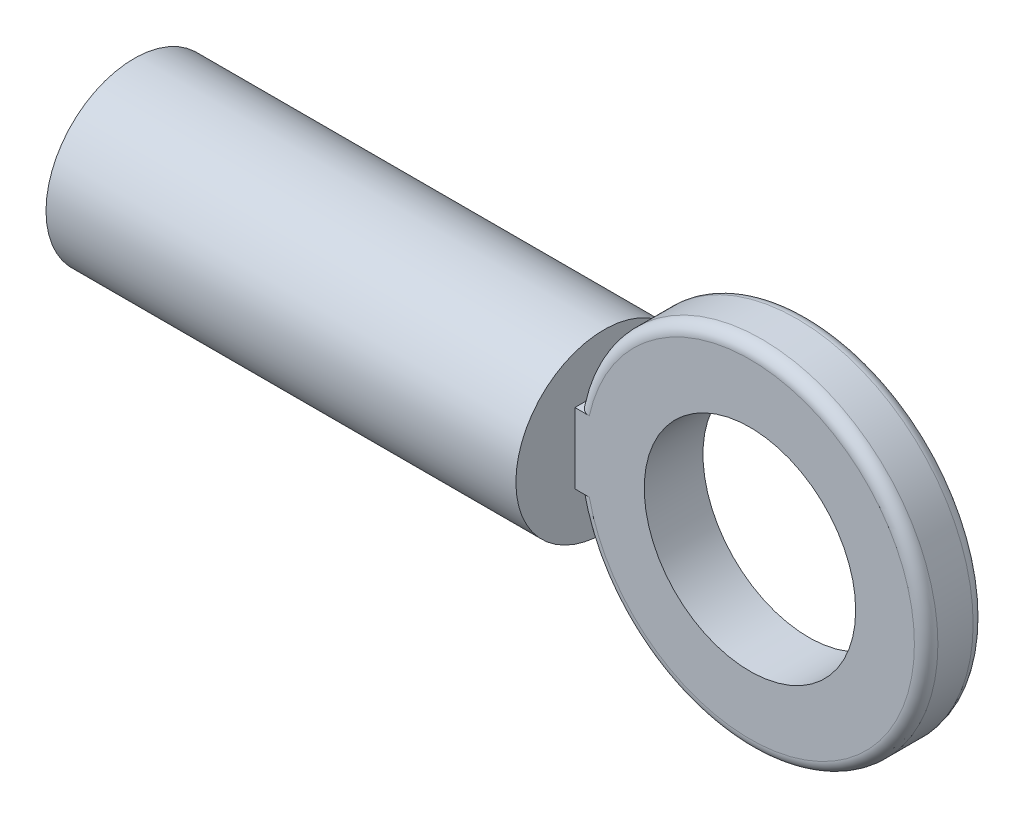
ISO-10303-21;
HEADER;
FILE_DESCRIPTION(('STEP AP214'),'2;1');
FILE_NAME('part.step','',(''),(''),'','','');
FILE_SCHEMA(('AUTOMOTIVE_DESIGN { 1 0 10303 214 1 1 1 1 }'));
ENDSEC;
DATA;
#1=APPLICATION_CONTEXT('core data for automotive mechanical design processes');
#2=APPLICATION_PROTOCOL_DEFINITION('international standard','automotive_design',2000,#1);
#3=PRODUCT_CONTEXT('',#1,'mechanical');
#4=PRODUCT('Part','Part','',(#3));
#5=PRODUCT_RELATED_PRODUCT_CATEGORY('part','',(#4));
#6=PRODUCT_DEFINITION_FORMATION('','',#4);
#7=PRODUCT_DEFINITION_CONTEXT('part definition',#1,'design');
#8=PRODUCT_DEFINITION('design','',#6,#7);
#9=PRODUCT_DEFINITION_SHAPE('','',#8);
#10=(LENGTH_UNIT() NAMED_UNIT(*) SI_UNIT(.MILLI.,.METRE.));
#11=(NAMED_UNIT(*) PLANE_ANGLE_UNIT() SI_UNIT($,.RADIAN.));
#12=(NAMED_UNIT(*) SI_UNIT($,.STERADIAN.) SOLID_ANGLE_UNIT());
#13=UNCERTAINTY_MEASURE_WITH_UNIT(LENGTH_MEASURE(1.E-05),#10,'distance_accuracy_value','');
#14=(GEOMETRIC_REPRESENTATION_CONTEXT(3) GLOBAL_UNCERTAINTY_ASSIGNED_CONTEXT((#13)) GLOBAL_UNIT_ASSIGNED_CONTEXT((#10,
#11,#12)) REPRESENTATION_CONTEXT('',''));
#15=CARTESIAN_POINT('',(0.,0.,0.));
#16=DIRECTION('',(0.,0.,1.));
#17=DIRECTION('',(1.,0.,0.));
#18=AXIS2_PLACEMENT_3D('',#15,#16,#17);
#19=CARTESIAN_POINT('',(-14.6969384566991,3.,5.));
#20=DIRECTION('',(0.,-1.,0.));
#21=DIRECTION('',(0.,0.,-1.));
#22=AXIS2_PLACEMENT_3D('',#19,#20,#21);
#23=PLANE('',#22);
#24=DIRECTION('',(0.,0.,-1.));
#25=VECTOR('',#24,1.);
#26=CARTESIAN_POINT('',(-14.8989794855664,3.,5.));
#27=LINE('',#26,#25);
#28=CARTESIAN_POINT('',(-14.8989794855664,3.,5.));
#29=VERTEX_POINT('',#28);
#30=CARTESIAN_POINT('',(-14.8989794855664,3.,0.));
#31=VERTEX_POINT('',#30);
#32=EDGE_CURVE('E65',#29,#31,#27,.T.);
#33=ORIENTED_EDGE('',*,*,#32,.F.);
#34=DIRECTION('',(-1.,0.,0.));
#35=VECTOR('',#34,1.);
#36=CARTESIAN_POINT('',(-14.6969384566991,3.,5.));
#37=LINE('',#36,#35);
#38=CARTESIAN_POINT('',(-13.6747943311773,3.,5.));
#39=VERTEX_POINT('',#38);
#40=EDGE_CURVE('E102',#39,#29,#37,.T.);
#41=ORIENTED_EDGE('',*,*,#40,.F.);
#42=CARTESIAN_POINT('',(-13.6747943311773,3.,5.));
#43=CARTESIAN_POINT('',(-13.7332773974036,3.,5.00004397370666));
#44=CARTESIAN_POINT('',(-13.7917566209697,3.,4.99510750923122));
#45=CARTESIAN_POINT('',(-13.9070751236367,3.,4.97556814786607));
#46=CARTESIAN_POINT('',(-13.9639144738787,3.,4.960965670968));
#47=CARTESIAN_POINT('',(-14.0743693140329,3.,4.92237366519746));
#48=CARTESIAN_POINT('',(-14.1279822597004,3.,4.89837683729497));
#49=CARTESIAN_POINT('',(-14.2303317389948,3.,4.84162531355459));
#50=CARTESIAN_POINT('',(-14.279070214233,3.,4.80887412402157));
#51=CARTESIAN_POINT('',(-14.3696436149678,3.,4.7359269444308));
#52=CARTESIAN_POINT('',(-14.4115551423863,3.,4.69582612637257));
#53=CARTESIAN_POINT('',(-14.4878842592286,3.,4.60901084651316));
#54=CARTESIAN_POINT('',(-14.5223006974817,3.,4.56229537058255));
#55=CARTESIAN_POINT('',(-14.5818850615291,3.,4.46463995957378));
#56=CARTESIAN_POINT('',(-14.6072307540319,3.,4.41380833124174));
#57=CARTESIAN_POINT('',(-14.6488326492022,3.,4.3085739468775));
#58=CARTESIAN_POINT('',(-14.665096927209,3.,4.25417441174859));
#59=CARTESIAN_POINT('',(-14.6833357439718,3.,4.16611761834799));
#60=CARTESIAN_POINT('',(-14.6884340691561,3.,4.13307648260181));
#61=CARTESIAN_POINT('',(-14.6952343004088,3.,4.06669547756618));
#62=CARTESIAN_POINT('',(-14.6969411623811,3.,4.03335611579334));
#63=CARTESIAN_POINT('',(-14.6969384566991,3.,4.));
#64=B_SPLINE_CURVE_WITH_KNOTS('',3,(#42,#43,#44,#45,#46,#47,#48,#49,#50,#51,#52,#53,#54,#55,#56,
#57,#58,#59,#60,#61,#62,#63),.UNSPECIFIED.,.F.,.F.,(4,2,2,2,2,2,2,2,2,2,4),(0.,
0.175237283661099,0.350466953700384,0.525833041161972,0.701128995810935,0.874297596550424,
1.04749277552178,1.21707912193985,1.38651442832325,1.48665279755499,1.58664472787211),.UNSPECIFIED.);
#65=CARTESIAN_POINT('',(-14.6969384566991,3.,4.));
#66=VERTEX_POINT('',#65);
#67=EDGE_CURVE('E196',#39,#66,#64,.T.);
#68=ORIENTED_EDGE('',*,*,#67,.T.);
#69=DIRECTION('',(0.,0.,-1.));
#70=VECTOR('',#69,1.);
#71=CARTESIAN_POINT('',(-14.6969384566991,3.,5.));
#72=LINE('',#71,#70);
#73=CARTESIAN_POINT('',(-14.6969384566991,3.,1.));
#74=VERTEX_POINT('',#73);
#75=EDGE_CURVE('E131',#66,#74,#72,.T.);
#76=ORIENTED_EDGE('',*,*,#75,.T.);
#77=CARTESIAN_POINT('',(-14.6969384566991,3.,1.));
#78=CARTESIAN_POINT('',(-14.6969385501578,3.,0.972285889496588));
#79=CARTESIAN_POINT('',(-14.695761829512,3.,0.944585193604562));
#80=CARTESIAN_POINT('',(-14.6910693122999,3.,0.889385040622232));
#81=CARTESIAN_POINT('',(-14.6875537169513,3.,0.861885566426197));
#82=CARTESIAN_POINT('',(-14.6735405994503,3.,0.780062849960405));
#83=CARTESIAN_POINT('',(-14.6595765976205,3.,0.726292599048655));
#84=CARTESIAN_POINT('',(-14.6228352807175,3.,0.621869210937748));
#85=CARTESIAN_POINT('',(-14.6000553727367,3.,0.571216995890707));
#86=CARTESIAN_POINT('',(-14.5463843131368,3.,0.474408286993331));
#87=CARTESIAN_POINT('',(-14.5154933563998,3.,0.428251685164557));
#88=CARTESIAN_POINT('',(-14.4462349607081,3.,0.341305552933714));
#89=CARTESIAN_POINT('',(-14.4078068508312,3.,0.300564405243511));
#90=CARTESIAN_POINT('',(-14.3247651340901,3.,0.225957290863242));
#91=CARTESIAN_POINT('',(-14.2801501905498,3.,0.192092813796366));
#92=CARTESIAN_POINT('',(-14.1850908586779,3.,0.13150251246788));
#93=CARTESIAN_POINT('',(-14.1345501252878,3.,0.104928016355623));
#94=CARTESIAN_POINT('',(-14.0297912005071,3.,0.0604556675639553));
#95=CARTESIAN_POINT('',(-13.975573947962,3.,0.042555609197942));
#96=CARTESIAN_POINT('',(-13.8801045624826,3.,0.0194918852721922));
#97=CARTESIAN_POINT('',(-13.8393557008949,3.,0.0121849036763054));
#98=CARTESIAN_POINT('',(-13.7573401994797,3.,0.00243908445292194));
#99=CARTESIAN_POINT('',(-13.7160744025564,3.,-6.84575789281902E-06));
#100=CARTESIAN_POINT('',(-13.6747943311773,3.,0.));
#101=B_SPLINE_CURVE_WITH_KNOTS('',3,(#77,#78,#79,#80,#81,#82,#83,#84,#85,#86,#87,#88,#89,#90,
#91,#92,#93,#94,#95,#96,#97,#98,#99,#100),.UNSPECIFIED.,.F.,.F.,(4,2,2,2,2,2,2,2,2,2,2,4),(0.,
0.0830907896102643,0.166174431691594,0.331978300145524,0.497830971437731,0.663679658194319,
0.830922621423314,0.998201774237879,1.16872798402752,1.33921081060304,1.46313142794583,
1.58687110409068),.UNSPECIFIED.);
#102=CARTESIAN_POINT('',(-13.6747943311773,3.,0.));
#103=VERTEX_POINT('',#102);
#104=EDGE_CURVE('E143',#74,#103,#101,.T.);
#105=ORIENTED_EDGE('',*,*,#104,.T.);
#106=DIRECTION('',(-1.,0.,0.));
#107=VECTOR('',#106,1.);
#108=CARTESIAN_POINT('',(-14.6969384566991,3.,0.));
#109=LINE('',#108,#107);
#110=EDGE_CURVE('E103',#103,#31,#109,.T.);
#111=ORIENTED_EDGE('',*,*,#110,.T.);
#112=EDGE_LOOP('',(#33,#41,#68,#76,#105,#111));
#113=FACE_BOUND('',#112,.T.);
#114=ADVANCED_FACE('F41',(#113),#23,.F.);
#115=CARTESIAN_POINT('',(-14.6969384566991,-3.,5.));
#116=DIRECTION('',(0.,1.,0.));
#117=DIRECTION('',(0.,0.,1.));
#118=AXIS2_PLACEMENT_3D('',#115,#116,#117);
#119=PLANE('',#118);
#120=DIRECTION('',(0.,0.,1.));
#121=VECTOR('',#120,1.);
#122=CARTESIAN_POINT('',(-14.8989794855664,-3.,5.));
#123=LINE('',#122,#121);
#124=CARTESIAN_POINT('',(-14.8989794855664,-3.,0.));
#125=VERTEX_POINT('',#124);
#126=CARTESIAN_POINT('',(-14.8989794855664,-3.,5.));
#127=VERTEX_POINT('',#126);
#128=EDGE_CURVE('E106',#125,#127,#123,.T.);
#129=ORIENTED_EDGE('',*,*,#128,.F.);
#130=DIRECTION('',(1.,0.,0.));
#131=VECTOR('',#130,1.);
#132=CARTESIAN_POINT('',(-14.6969384566991,-3.,0.));
#133=LINE('',#132,#131);
#134=CARTESIAN_POINT('',(-13.6747943311773,-3.,0.));
#135=VERTEX_POINT('',#134);
#136=EDGE_CURVE('E95',#125,#135,#133,.T.);
#137=ORIENTED_EDGE('',*,*,#136,.T.);
#138=CARTESIAN_POINT('',(-13.6747943311773,-3.,0.));
#139=CARTESIAN_POINT('',(-13.7332773974036,-3.,-4.39737066575906E-05));
#140=CARTESIAN_POINT('',(-13.7917566209697,-3.,0.00489249076878266));
#141=CARTESIAN_POINT('',(-13.9070751236367,-3.,0.0244318521339298));
#142=CARTESIAN_POINT('',(-13.9639144738787,-3.,0.0390343290319995));
#143=CARTESIAN_POINT('',(-14.0743693140329,-3.,0.0776263348025358));
#144=CARTESIAN_POINT('',(-14.1279822597004,-3.,0.10162316270503));
#145=CARTESIAN_POINT('',(-14.2303317389948,-3.,0.158374686445411));
#146=CARTESIAN_POINT('',(-14.279070214233,-3.,0.19112587597843));
#147=CARTESIAN_POINT('',(-14.3696436149678,-3.,0.264073055569197));
#148=CARTESIAN_POINT('',(-14.4115551423863,-3.,0.304173873627432));
#149=CARTESIAN_POINT('',(-14.4878842592286,-3.,0.390989153486845));
#150=CARTESIAN_POINT('',(-14.5223006974817,-3.,0.437704629417454));
#151=CARTESIAN_POINT('',(-14.5818850615291,-3.,0.535360040426225));
#152=CARTESIAN_POINT('',(-14.6072307540319,-3.,0.586191668758255));
#153=CARTESIAN_POINT('',(-14.6488326492022,-3.,0.691426053122499));
#154=CARTESIAN_POINT('',(-14.665096927209,-3.,0.745825588251411));
#155=CARTESIAN_POINT('',(-14.6833357439718,-3.,0.833882381652008));
#156=CARTESIAN_POINT('',(-14.6884340691561,-3.,0.866923517398192));
#157=CARTESIAN_POINT('',(-14.6952343004088,-3.,0.933304522433815));
#158=CARTESIAN_POINT('',(-14.6969411623811,-3.,0.96664388420666));
#159=CARTESIAN_POINT('',(-14.6969384566991,-3.,0.999999999999999));
#160=B_SPLINE_CURVE_WITH_KNOTS('',3,(#138,#139,#140,#141,#142,#143,#144,#145,#146,#147,#148,
#149,#150,#151,#152,#153,#154,#155,#156,#157,#158,#159),.UNSPECIFIED.,.F.,.F.,(4,2,2,2,2,2,2,2,
2,2,4),(0.,0.175237283661099,0.350466953700384,0.525833041161968,0.701128995810935,
0.874297596550425,1.04749277552178,1.21707912193985,1.38651442832325,1.48665279755499,
1.58664472787211),.UNSPECIFIED.);
#161=CARTESIAN_POINT('',(-14.6969384566991,-3.,1.));
#162=VERTEX_POINT('',#161);
#163=EDGE_CURVE('E151',#135,#162,#160,.T.);
#164=ORIENTED_EDGE('',*,*,#163,.T.);
#165=DIRECTION('',(0.,0.,-1.));
#166=VECTOR('',#165,1.);
#167=CARTESIAN_POINT('',(-14.6969384566991,-3.,5.));
#168=LINE('',#167,#166);
#169=CARTESIAN_POINT('',(-14.6969384566991,-3.,4.));
#170=VERTEX_POINT('',#169);
#171=EDGE_CURVE('E127',#170,#162,#168,.T.);
#172=ORIENTED_EDGE('',*,*,#171,.F.);
#173=CARTESIAN_POINT('',(-14.6969384566991,-3.,4.));
#174=CARTESIAN_POINT('',(-14.6969385501578,-3.,4.02771411050341));
#175=CARTESIAN_POINT('',(-14.695761829512,-3.,4.05541480639544));
#176=CARTESIAN_POINT('',(-14.6910693122999,-3.,4.11061495937777));
#177=CARTESIAN_POINT('',(-14.6875537169513,-3.,4.1381144335738));
#178=CARTESIAN_POINT('',(-14.6735405994503,-3.,4.21993715003959));
#179=CARTESIAN_POINT('',(-14.6595765976205,-3.,4.27370740095134));
#180=CARTESIAN_POINT('',(-14.6228352807175,-3.,4.37813078906225));
#181=CARTESIAN_POINT('',(-14.6000553727367,-3.,4.42878300410929));
#182=CARTESIAN_POINT('',(-14.5463843131368,-3.,4.52559171300667));
#183=CARTESIAN_POINT('',(-14.5154933563998,-3.,4.57174831483544));
#184=CARTESIAN_POINT('',(-14.4462349607081,-3.,4.65869444706629));
#185=CARTESIAN_POINT('',(-14.4078068508312,-3.,4.69943559475649));
#186=CARTESIAN_POINT('',(-14.3247651340901,-3.,4.77404270913676));
#187=CARTESIAN_POINT('',(-14.2801501905498,-3.,4.80790718620363));
#188=CARTESIAN_POINT('',(-14.1850908586779,-3.,4.86849748753212));
#189=CARTESIAN_POINT('',(-14.1345501252878,-3.,4.89507198364438));
#190=CARTESIAN_POINT('',(-14.0297912005071,-3.,4.93954433243604));
#191=CARTESIAN_POINT('',(-13.975573947962,-3.,4.95744439080206));
#192=CARTESIAN_POINT('',(-13.8801045624826,-3.,4.98050811472781));
#193=CARTESIAN_POINT('',(-13.8393557008949,-3.,4.9878150963237));
#194=CARTESIAN_POINT('',(-13.7573401994797,-3.,4.99756091554708));
#195=CARTESIAN_POINT('',(-13.7160744025564,-3.,5.00000684575789));
#196=CARTESIAN_POINT('',(-13.6747943311773,-3.,5.));
#197=B_SPLINE_CURVE_WITH_KNOTS('',3,(#173,#174,#175,#176,#177,#178,#179,#180,#181,#182,#183,
#184,#185,#186,#187,#188,#189,#190,#191,#192,#193,#194,#195,#196),.UNSPECIFIED.,.F.,.F.,(4,2,2,
2,2,2,2,2,2,2,2,4),(0.,0.0830907896102651,0.166174431691594,0.331978300145524,0.497830971437732,
0.663679658194319,0.830922621423316,0.998201774237879,1.16872798402752,1.33921081060304,
1.46313142794583,1.58687110409068),.UNSPECIFIED.);
#198=CARTESIAN_POINT('',(-13.6747943311773,-3.,5.));
#199=VERTEX_POINT('',#198);
#200=EDGE_CURVE('E50',#170,#199,#197,.T.);
#201=ORIENTED_EDGE('',*,*,#200,.T.);
#202=DIRECTION('',(1.,0.,0.));
#203=VECTOR('',#202,1.);
#204=CARTESIAN_POINT('',(-14.6969384566991,-3.,5.));
#205=LINE('',#204,#203);
#206=EDGE_CURVE('E109',#127,#199,#205,.T.);
#207=ORIENTED_EDGE('',*,*,#206,.F.);
#208=EDGE_LOOP('',(#129,#137,#164,#172,#201,#207));
#209=FACE_BOUND('',#208,.T.);
#210=ADVANCED_FACE('F107',(#209),#119,.F.);
#211=CARTESIAN_POINT('',(0.,0.,5.));
#212=DIRECTION('',(0.,0.,1.));
#213=DIRECTION('',(1.,0.,0.));
#214=AXIS2_PLACEMENT_3D('',#211,#212,#213);
#215=PLANE('',#214);
#216=CARTESIAN_POINT('',(0.,0.,5.));
#217=DIRECTION('',(0.,0.,1.));
#218=DIRECTION('',(1.,0.,0.));
#219=AXIS2_PLACEMENT_3D('',#216,#217,#218);
#220=CIRCLE('',#219,9.);
#221=CARTESIAN_POINT('',(9.,0.,5.));
#222=VERTEX_POINT('',#221);
#223=EDGE_CURVE('E116',#222,#222,#220,.T.);
#224=ORIENTED_EDGE('',*,*,#223,.F.);
#225=EDGE_LOOP('',(#224));
#226=FACE_BOUND('',#225,.T.);
#227=ORIENTED_EDGE('',*,*,#40,.T.);
#228=DIRECTION('',(0.,-1.,0.));
#229=VECTOR('',#228,1.);
#230=CARTESIAN_POINT('',(-14.8989794855664,0.,5.));
#231=LINE('',#230,#229);
#232=EDGE_CURVE('E57',#29,#127,#231,.T.);
#233=ORIENTED_EDGE('',*,*,#232,.T.);
#234=ORIENTED_EDGE('',*,*,#206,.T.);
#235=CARTESIAN_POINT('',(0.,0.,5.));
#236=DIRECTION('',(0.,0.,1.));
#237=DIRECTION('',(1.,0.,0.));
#238=AXIS2_PLACEMENT_3D('',#235,#236,#237);
#239=CIRCLE('',#238,14.);
#240=EDGE_CURVE('E140',#199,#39,#239,.T.);
#241=ORIENTED_EDGE('',*,*,#240,.T.);
#242=EDGE_LOOP('',(#227,#233,#234,#241));
#243=FACE_BOUND('',#242,.T.);
#244=ADVANCED_FACE('F176',(#226,#243),#215,.T.);
#245=CARTESIAN_POINT('',(0.,0.,0.));
#246=DIRECTION('',(0.,0.,1.));
#247=DIRECTION('',(1.,0.,0.));
#248=AXIS2_PLACEMENT_3D('',#245,#246,#247);
#249=PLANE('',#248);
#250=CARTESIAN_POINT('',(0.,0.,0.));
#251=DIRECTION('',(0.,0.,1.));
#252=DIRECTION('',(1.,0.,0.));
#253=AXIS2_PLACEMENT_3D('',#250,#251,#252);
#254=CIRCLE('',#253,9.);
#255=CARTESIAN_POINT('',(9.,0.,0.));
#256=VERTEX_POINT('',#255);
#257=EDGE_CURVE('E120',#256,#256,#254,.T.);
#258=ORIENTED_EDGE('',*,*,#257,.T.);
#259=EDGE_LOOP('',(#258));
#260=FACE_BOUND('',#259,.T.);
#261=DIRECTION('',(0.,-1.,0.));
#262=VECTOR('',#261,1.);
#263=CARTESIAN_POINT('',(-14.8989794855664,0.,0.));
#264=LINE('',#263,#262);
#265=EDGE_CURVE('E11',#31,#125,#264,.T.);
#266=ORIENTED_EDGE('',*,*,#265,.F.);
#267=ORIENTED_EDGE('',*,*,#110,.F.);
#268=CARTESIAN_POINT('',(0.,0.,0.));
#269=DIRECTION('',(0.,0.,1.));
#270=DIRECTION('',(1.,0.,0.));
#271=AXIS2_PLACEMENT_3D('',#268,#269,#270);
#272=CIRCLE('',#271,14.);
#273=EDGE_CURVE('E99',#103,#135,#272,.F.);
#274=ORIENTED_EDGE('',*,*,#273,.T.);
#275=ORIENTED_EDGE('',*,*,#136,.F.);
#276=EDGE_LOOP('',(#266,#267,#274,#275));
#277=FACE_BOUND('',#276,.T.);
#278=ADVANCED_FACE('F97',(#260,#277),#249,.F.);
#279=CARTESIAN_POINT('',(0.,0.,5.));
#280=DIRECTION('',(0.,0.,-1.));
#281=DIRECTION('',(-1.,0.,0.));
#282=AXIS2_PLACEMENT_3D('',#279,#280,#281);
#283=CYLINDRICAL_SURFACE('',#282,15.);
#284=ORIENTED_EDGE('',*,*,#171,.T.);
#285=CARTESIAN_POINT('',(0.,0.,1.));
#286=DIRECTION('',(0.,0.,1.));
#287=DIRECTION('',(1.,0.,0.));
#288=AXIS2_PLACEMENT_3D('',#285,#286,#287);
#289=CIRCLE('',#288,15.);
#290=EDGE_CURVE('E136',#162,#74,#289,.T.);
#291=ORIENTED_EDGE('',*,*,#290,.T.);
#292=ORIENTED_EDGE('',*,*,#75,.F.);
#293=CARTESIAN_POINT('',(0.,0.,4.));
#294=DIRECTION('',(0.,0.,1.));
#295=DIRECTION('',(1.,0.,0.));
#296=AXIS2_PLACEMENT_3D('',#293,#294,#295);
#297=CIRCLE('',#296,15.);
#298=EDGE_CURVE('E134',#66,#170,#297,.F.);
#299=ORIENTED_EDGE('',*,*,#298,.T.);
#300=EDGE_LOOP('',(#284,#291,#292,#299));
#301=FACE_BOUND('',#300,.T.);
#302=ADVANCED_FACE('F166',(#301),#283,.T.);
#303=CARTESIAN_POINT('',(0.,0.,0.));
#304=DIRECTION('',(0.,0.,1.));
#305=DIRECTION('',(1.,0.,0.));
#306=AXIS2_PLACEMENT_3D('',#303,#304,#305);
#307=CYLINDRICAL_SURFACE('',#306,9.);
#308=ORIENTED_EDGE('',*,*,#257,.F.);
#309=EDGE_LOOP('',(#308));
#310=FACE_BOUND('',#309,.T.);
#311=ORIENTED_EDGE('',*,*,#223,.T.);
#312=EDGE_LOOP('',(#311));
#313=FACE_BOUND('',#312,.T.);
#314=ADVANCED_FACE('F164',(#310,#313),#307,.F.);
#315=CARTESIAN_POINT('',(0.,0.,1.));
#316=DIRECTION('',(0.,0.,1.));
#317=DIRECTION('',(1.,0.,0.));
#318=AXIS2_PLACEMENT_3D('',#315,#316,#317);
#319=TOROIDAL_SURFACE('',#318,14.,1.);
#320=ORIENTED_EDGE('',*,*,#163,.F.);
#321=ORIENTED_EDGE('',*,*,#273,.F.);
#322=ORIENTED_EDGE('',*,*,#104,.F.);
#323=ORIENTED_EDGE('',*,*,#290,.F.);
#324=EDGE_LOOP('',(#320,#321,#322,#323));
#325=FACE_BOUND('',#324,.T.);
#326=ADVANCED_FACE('F161',(#325),#319,.T.);
#327=CARTESIAN_POINT('',(0.,0.,4.));
#328=DIRECTION('',(0.,0.,1.));
#329=DIRECTION('',(1.,0.,0.));
#330=AXIS2_PLACEMENT_3D('',#327,#328,#329);
#331=TOROIDAL_SURFACE('',#330,14.,1.);
#332=ORIENTED_EDGE('',*,*,#200,.F.);
#333=ORIENTED_EDGE('',*,*,#298,.F.);
#334=ORIENTED_EDGE('',*,*,#67,.F.);
#335=ORIENTED_EDGE('',*,*,#240,.F.);
#336=EDGE_LOOP('',(#332,#333,#334,#335));
#337=FACE_BOUND('',#336,.T.);
#338=ADVANCED_FACE('F43',(#337),#331,.T.);
#339=CARTESIAN_POINT('',(-14.8989794855664,0.,2.52808800762765));
#340=DIRECTION('',(-1.,0.,0.));
#341=DIRECTION('',(0.,0.,1.));
#342=AXIS2_PLACEMENT_3D('',#339,#340,#341);
#343=CYLINDRICAL_SURFACE('',#342,7.5);
#344=CARTESIAN_POINT('',(-14.8989794855664,0.,2.52808800762765));
#345=DIRECTION('',(-1.,0.,0.));
#346=DIRECTION('',(0.,0.,1.));
#347=AXIS2_PLACEMENT_3D('',#344,#345,#346);
#348=CIRCLE('',#347,7.5);
#349=CARTESIAN_POINT('',(-14.8989794855664,0.,10.0280880076277));
#350=VERTEX_POINT('',#349);
#351=EDGE_CURVE('E111',#350,#350,#348,.T.);
#352=ORIENTED_EDGE('',*,*,#351,.T.);
#353=EDGE_LOOP('',(#352));
#354=FACE_BOUND('',#353,.T.);
#355=CARTESIAN_POINT('',(-54.8989794855664,0.,2.52808800762765));
#356=DIRECTION('',(-1.,0.,0.));
#357=DIRECTION('',(0.,0.,1.));
#358=AXIS2_PLACEMENT_3D('',#355,#356,#357);
#359=CIRCLE('',#358,7.5);
#360=CARTESIAN_POINT('',(-54.8989794855664,0.,10.0280880076277));
#361=VERTEX_POINT('',#360);
#362=EDGE_CURVE('E224',#361,#361,#359,.T.);
#363=ORIENTED_EDGE('',*,*,#362,.F.);
#364=EDGE_LOOP('',(#363));
#365=FACE_BOUND('',#364,.T.);
#366=ADVANCED_FACE('F209',(#354,#365),#343,.T.);
#367=CARTESIAN_POINT('',(-14.8989794855664,0.,2.52808800762765));
#368=DIRECTION('',(-1.,0.,0.));
#369=DIRECTION('',(0.,0.,1.));
#370=AXIS2_PLACEMENT_3D('',#367,#368,#369);
#371=PLANE('',#370);
#372=ORIENTED_EDGE('',*,*,#232,.F.);
#373=ORIENTED_EDGE('',*,*,#32,.T.);
#374=ORIENTED_EDGE('',*,*,#265,.T.);
#375=ORIENTED_EDGE('',*,*,#128,.T.);
#376=EDGE_LOOP('',(#372,#373,#374,#375));
#377=FACE_BOUND('',#376,.T.);
#378=ORIENTED_EDGE('',*,*,#351,.F.);
#379=EDGE_LOOP('',(#378));
#380=FACE_BOUND('',#379,.T.);
#381=ADVANCED_FACE('F113',(#377,#380),#371,.F.);
#382=CARTESIAN_POINT('',(-54.8989794855664,-3.,5.));
#383=DIRECTION('',(1.,0.,0.));
#384=DIRECTION('',(0.,0.,-1.));
#385=AXIS2_PLACEMENT_3D('',#382,#383,#384);
#386=PLANE('',#385);
#387=ORIENTED_EDGE('',*,*,#362,.T.);
#388=EDGE_LOOP('',(#387));
#389=FACE_BOUND('',#388,.T.);
#390=ADVANCED_FACE('F190',(#389),#386,.F.);
#391=CLOSED_SHELL('',(#114,#210,#244,#278,#302,#314,#326,#338,#366,#381,#390));
#392=MANIFOLD_SOLID_BREP('B2',#391);
#393=ADVANCED_BREP_SHAPE_REPRESENTATION('',(#18,#392),#14);
#394=SHAPE_DEFINITION_REPRESENTATION(#9,#393);
ENDSEC;
END-ISO-10303-21;
